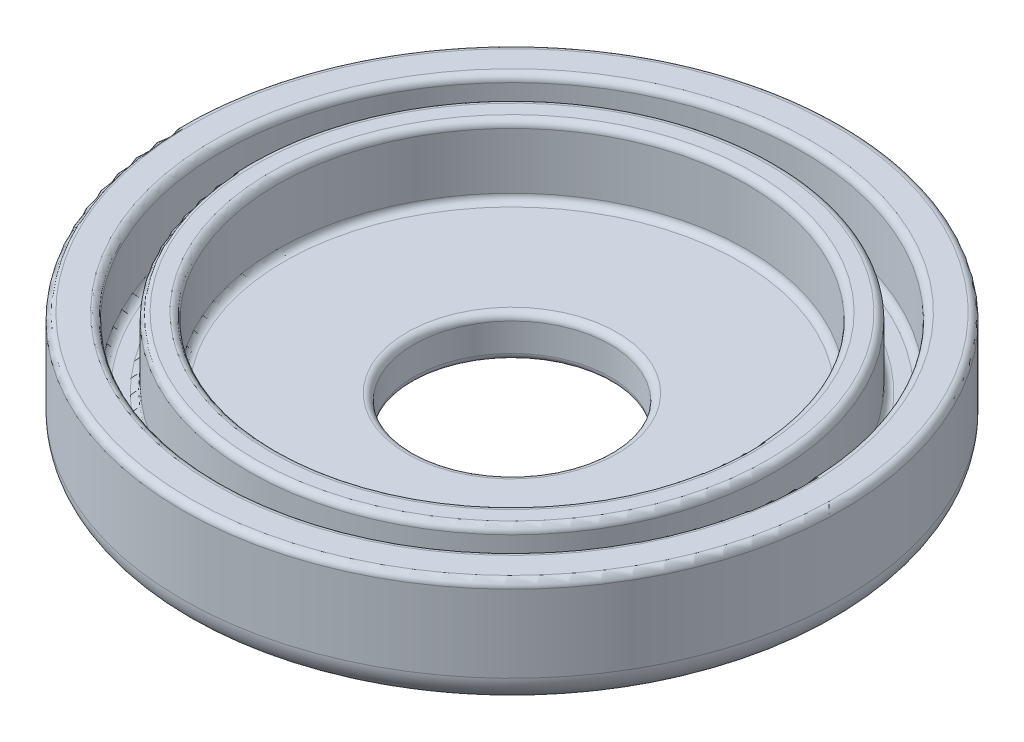
ISO-10303-21;
HEADER;
FILE_DESCRIPTION(('STEP AP214'),'2;1');
FILE_NAME('part.step','',(''),(''),'','','');
FILE_SCHEMA(('AUTOMOTIVE_DESIGN { 1 0 10303 214 1 1 1 1 }'));
ENDSEC;
DATA;
#1=APPLICATION_CONTEXT('core data for automotive mechanical design processes');
#2=APPLICATION_PROTOCOL_DEFINITION('international standard','automotive_design',2000,#1);
#3=PRODUCT_CONTEXT('',#1,'mechanical');
#4=PRODUCT('Part','Part','',(#3));
#5=PRODUCT_RELATED_PRODUCT_CATEGORY('part','',(#4));
#6=PRODUCT_DEFINITION_FORMATION('','',#4);
#7=PRODUCT_DEFINITION_CONTEXT('part definition',#1,'design');
#8=PRODUCT_DEFINITION('design','',#6,#7);
#9=PRODUCT_DEFINITION_SHAPE('','',#8);
#10=(LENGTH_UNIT() NAMED_UNIT(*) SI_UNIT(.MILLI.,.METRE.));
#11=(NAMED_UNIT(*) PLANE_ANGLE_UNIT() SI_UNIT($,.RADIAN.));
#12=(NAMED_UNIT(*) SI_UNIT($,.STERADIAN.) SOLID_ANGLE_UNIT());
#13=UNCERTAINTY_MEASURE_WITH_UNIT(LENGTH_MEASURE(1.E-05),#10,'distance_accuracy_value','');
#14=(GEOMETRIC_REPRESENTATION_CONTEXT(3) GLOBAL_UNCERTAINTY_ASSIGNED_CONTEXT((#13)) GLOBAL_UNIT_ASSIGNED_CONTEXT((#10,
#11,#12)) REPRESENTATION_CONTEXT('',''));
#15=CARTESIAN_POINT('',(0.,0.,0.));
#16=DIRECTION('',(0.,0.,1.));
#17=DIRECTION('',(1.,0.,0.));
#18=AXIS2_PLACEMENT_3D('',#15,#16,#17);
#19=CARTESIAN_POINT('',(0.,8.,0.));
#20=DIRECTION('',(0.,-1.,0.));
#21=DIRECTION('',(0.,0.,-1.));
#22=AXIS2_PLACEMENT_3D('',#19,#20,#21);
#23=CYLINDRICAL_SURFACE('',#22,23.5);
#24=CARTESIAN_POINT('',(0.,2.,0.));
#25=DIRECTION('',(0.,1.,0.));
#26=DIRECTION('',(0.,0.,1.));
#27=AXIS2_PLACEMENT_3D('',#24,#25,#26);
#28=CIRCLE('',#27,23.5);
#29=CARTESIAN_POINT('',(0.,2.,23.5));
#30=VERTEX_POINT('',#29);
#31=EDGE_CURVE('E39',#30,#30,#28,.T.);
#32=ORIENTED_EDGE('',*,*,#31,.T.);
#33=EDGE_LOOP('',(#32));
#34=FACE_BOUND('',#33,.T.);
#35=CARTESIAN_POINT('',(0.,7.5,0.));
#36=DIRECTION('',(0.,1.,0.));
#37=DIRECTION('',(0.,0.,1.));
#38=AXIS2_PLACEMENT_3D('',#35,#36,#37);
#39=CIRCLE('',#38,23.5);
#40=CARTESIAN_POINT('',(0.,7.5,23.5));
#41=VERTEX_POINT('',#40);
#42=EDGE_CURVE('E91',#41,#41,#39,.F.);
#43=ORIENTED_EDGE('',*,*,#42,.T.);
#44=EDGE_LOOP('',(#43));
#45=FACE_BOUND('',#44,.T.);
#46=ADVANCED_FACE('F32',(#34,#45),#23,.T.);
#47=CARTESIAN_POINT('',(0.,8.,0.));
#48=DIRECTION('',(0.,1.,0.));
#49=DIRECTION('',(0.,0.,1.));
#50=AXIS2_PLACEMENT_3D('',#47,#48,#49);
#51=PLANE('',#50);
#52=CARTESIAN_POINT('',(0.,8.,0.));
#53=DIRECTION('',(0.,1.,0.));
#54=DIRECTION('',(0.,0.,1.));
#55=AXIS2_PLACEMENT_3D('',#52,#53,#54);
#56=CIRCLE('',#55,23.);
#57=CARTESIAN_POINT('',(0.,8.,23.));
#58=VERTEX_POINT('',#57);
#59=EDGE_CURVE('E94',#58,#58,#56,.T.);
#60=ORIENTED_EDGE('',*,*,#59,.T.);
#61=EDGE_LOOP('',(#60));
#62=FACE_BOUND('',#61,.T.);
#63=CARTESIAN_POINT('',(0.,8.,0.));
#64=DIRECTION('',(0.,1.,0.));
#65=DIRECTION('',(0.,0.,1.));
#66=AXIS2_PLACEMENT_3D('',#63,#64,#65);
#67=CIRCLE('',#66,21.25);
#68=CARTESIAN_POINT('',(0.,8.,21.25));
#69=VERTEX_POINT('',#68);
#70=EDGE_CURVE('E97',#69,#69,#67,.F.);
#71=ORIENTED_EDGE('',*,*,#70,.T.);
#72=EDGE_LOOP('',(#71));
#73=FACE_BOUND('',#72,.T.);
#74=ADVANCED_FACE('F101',(#62,#73),#51,.T.);
#75=CARTESIAN_POINT('',(0.,0.,0.));
#76=DIRECTION('',(0.,1.,0.));
#77=DIRECTION('',(0.,0.,1.));
#78=AXIS2_PLACEMENT_3D('',#75,#76,#77);
#79=PLANE('',#78);
#80=CARTESIAN_POINT('',(0.,0.,0.));
#81=DIRECTION('',(0.,1.,0.));
#82=DIRECTION('',(0.,0.,1.));
#83=AXIS2_PLACEMENT_3D('',#80,#81,#82);
#84=CIRCLE('',#83,21.5);
#85=CARTESIAN_POINT('',(0.,0.,21.5));
#86=VERTEX_POINT('',#85);
#87=EDGE_CURVE('E10',#86,#86,#84,.F.);
#88=ORIENTED_EDGE('',*,*,#87,.T.);
#89=EDGE_LOOP('',(#88));
#90=FACE_BOUND('',#89,.T.);
#91=CARTESIAN_POINT('',(0.,0.,0.));
#92=DIRECTION('',(0.,1.,0.));
#93=DIRECTION('',(0.,0.,1.));
#94=AXIS2_PLACEMENT_3D('',#91,#92,#93);
#95=CIRCLE('',#94,7.5);
#96=CARTESIAN_POINT('',(0.,0.,7.5));
#97=VERTEX_POINT('',#96);
#98=EDGE_CURVE('E43',#97,#97,#95,.T.);
#99=ORIENTED_EDGE('',*,*,#98,.T.);
#100=EDGE_LOOP('',(#99));
#101=FACE_BOUND('',#100,.T.);
#102=ADVANCED_FACE('F115',(#90,#101),#79,.F.);
#103=CARTESIAN_POINT('',(0.,3.,0.));
#104=DIRECTION('',(0.,1.,0.));
#105=DIRECTION('',(0.,0.,1.));
#106=AXIS2_PLACEMENT_3D('',#103,#104,#105);
#107=CYLINDRICAL_SURFACE('',#106,20.75);
#108=CARTESIAN_POINT('',(0.,7.5,0.));
#109=DIRECTION('',(0.,1.,0.));
#110=DIRECTION('',(0.,0.,1.));
#111=AXIS2_PLACEMENT_3D('',#108,#109,#110);
#112=CIRCLE('',#111,20.75);
#113=CARTESIAN_POINT('',(0.,7.5,20.75));
#114=VERTEX_POINT('',#113);
#115=EDGE_CURVE('E85',#114,#114,#112,.T.);
#116=ORIENTED_EDGE('',*,*,#115,.T.);
#117=EDGE_LOOP('',(#116));
#118=FACE_BOUND('',#117,.T.);
#119=CARTESIAN_POINT('',(0.,3.5,0.));
#120=DIRECTION('',(0.,1.,0.));
#121=DIRECTION('',(0.,0.,1.));
#122=AXIS2_PLACEMENT_3D('',#119,#120,#121);
#123=CIRCLE('',#122,20.75);
#124=CARTESIAN_POINT('',(0.,3.5,20.75));
#125=VERTEX_POINT('',#124);
#126=EDGE_CURVE('E88',#125,#125,#123,.F.);
#127=ORIENTED_EDGE('',*,*,#126,.T.);
#128=EDGE_LOOP('',(#127));
#129=FACE_BOUND('',#128,.T.);
#130=ADVANCED_FACE('F111',(#118,#129),#107,.F.);
#131=CARTESIAN_POINT('',(0.,3.,0.));
#132=DIRECTION('',(0.,1.,0.));
#133=DIRECTION('',(0.,0.,1.));
#134=AXIS2_PLACEMENT_3D('',#131,#132,#133);
#135=PLANE('',#134);
#136=CARTESIAN_POINT('',(0.,3.,0.));
#137=DIRECTION('',(0.,1.,0.));
#138=DIRECTION('',(0.,0.,1.));
#139=AXIS2_PLACEMENT_3D('',#136,#137,#138);
#140=CIRCLE('',#139,20.25);
#141=CARTESIAN_POINT('',(0.,3.,20.25));
#142=VERTEX_POINT('',#141);
#143=EDGE_CURVE('E79',#142,#142,#140,.T.);
#144=ORIENTED_EDGE('',*,*,#143,.T.);
#145=EDGE_LOOP('',(#144));
#146=FACE_BOUND('',#145,.T.);
#147=CARTESIAN_POINT('',(0.,3.,0.));
#148=DIRECTION('',(0.,1.,0.));
#149=DIRECTION('',(0.,0.,1.));
#150=AXIS2_PLACEMENT_3D('',#147,#148,#149);
#151=CIRCLE('',#150,19.25);
#152=CARTESIAN_POINT('',(0.,3.,19.25));
#153=VERTEX_POINT('',#152);
#154=EDGE_CURVE('E82',#153,#153,#151,.F.);
#155=ORIENTED_EDGE('',*,*,#154,.T.);
#156=EDGE_LOOP('',(#155));
#157=FACE_BOUND('',#156,.T.);
#158=ADVANCED_FACE('F114',(#146,#157),#135,.T.);
#159=CARTESIAN_POINT('',(0.,8.,0.));
#160=DIRECTION('',(0.,-1.,0.));
#161=DIRECTION('',(0.,0.,-1.));
#162=AXIS2_PLACEMENT_3D('',#159,#160,#161);
#163=CYLINDRICAL_SURFACE('',#162,18.75);
#164=CARTESIAN_POINT('',(0.,3.5,0.));
#165=DIRECTION('',(0.,1.,0.));
#166=DIRECTION('',(0.,0.,1.));
#167=AXIS2_PLACEMENT_3D('',#164,#165,#166);
#168=CIRCLE('',#167,18.75);
#169=CARTESIAN_POINT('',(0.,3.5,18.75));
#170=VERTEX_POINT('',#169);
#171=EDGE_CURVE('E73',#170,#170,#168,.T.);
#172=ORIENTED_EDGE('',*,*,#171,.T.);
#173=EDGE_LOOP('',(#172));
#174=FACE_BOUND('',#173,.T.);
#175=CARTESIAN_POINT('',(0.,7.5,0.));
#176=DIRECTION('',(0.,1.,0.));
#177=DIRECTION('',(0.,0.,1.));
#178=AXIS2_PLACEMENT_3D('',#175,#176,#177);
#179=CIRCLE('',#178,18.75);
#180=CARTESIAN_POINT('',(0.,7.5,18.75));
#181=VERTEX_POINT('',#180);
#182=EDGE_CURVE('E76',#181,#181,#179,.F.);
#183=ORIENTED_EDGE('',*,*,#182,.T.);
#184=EDGE_LOOP('',(#183));
#185=FACE_BOUND('',#184,.T.);
#186=ADVANCED_FACE('F127',(#174,#185),#163,.T.);
#187=CARTESIAN_POINT('',(0.,8.,0.));
#188=DIRECTION('',(0.,1.,0.));
#189=DIRECTION('',(0.,0.,1.));
#190=AXIS2_PLACEMENT_3D('',#187,#188,#189);
#191=PLANE('',#190);
#192=CARTESIAN_POINT('',(0.,8.,0.));
#193=DIRECTION('',(0.,1.,0.));
#194=DIRECTION('',(0.,0.,1.));
#195=AXIS2_PLACEMENT_3D('',#192,#193,#194);
#196=CIRCLE('',#195,18.25);
#197=CARTESIAN_POINT('',(0.,8.,18.25));
#198=VERTEX_POINT('',#197);
#199=EDGE_CURVE('E67',#198,#198,#196,.T.);
#200=ORIENTED_EDGE('',*,*,#199,.T.);
#201=EDGE_LOOP('',(#200));
#202=FACE_BOUND('',#201,.T.);
#203=CARTESIAN_POINT('',(0.,8.,0.));
#204=DIRECTION('',(0.,1.,0.));
#205=DIRECTION('',(0.,0.,1.));
#206=AXIS2_PLACEMENT_3D('',#203,#204,#205);
#207=CIRCLE('',#206,17.25);
#208=CARTESIAN_POINT('',(0.,8.,17.25));
#209=VERTEX_POINT('',#208);
#210=EDGE_CURVE('E70',#209,#209,#207,.F.);
#211=ORIENTED_EDGE('',*,*,#210,.T.);
#212=EDGE_LOOP('',(#211));
#213=FACE_BOUND('',#212,.T.);
#214=ADVANCED_FACE('F139',(#202,#213),#191,.T.);
#215=CARTESIAN_POINT('',(0.,3.,0.));
#216=DIRECTION('',(0.,1.,0.));
#217=DIRECTION('',(0.,0.,1.));
#218=AXIS2_PLACEMENT_3D('',#215,#216,#217);
#219=CYLINDRICAL_SURFACE('',#218,16.75);
#220=CARTESIAN_POINT('',(0.,7.5,0.));
#221=DIRECTION('',(0.,1.,0.));
#222=DIRECTION('',(0.,0.,1.));
#223=AXIS2_PLACEMENT_3D('',#220,#221,#222);
#224=CIRCLE('',#223,16.75);
#225=CARTESIAN_POINT('',(0.,7.5,16.75));
#226=VERTEX_POINT('',#225);
#227=EDGE_CURVE('E61',#226,#226,#224,.T.);
#228=ORIENTED_EDGE('',*,*,#227,.T.);
#229=EDGE_LOOP('',(#228));
#230=FACE_BOUND('',#229,.T.);
#231=CARTESIAN_POINT('',(0.,3.5,0.));
#232=DIRECTION('',(0.,1.,0.));
#233=DIRECTION('',(0.,0.,1.));
#234=AXIS2_PLACEMENT_3D('',#231,#232,#233);
#235=CIRCLE('',#234,16.75);
#236=CARTESIAN_POINT('',(0.,3.5,16.75));
#237=VERTEX_POINT('',#236);
#238=EDGE_CURVE('E64',#237,#237,#235,.F.);
#239=ORIENTED_EDGE('',*,*,#238,.T.);
#240=EDGE_LOOP('',(#239));
#241=FACE_BOUND('',#240,.T.);
#242=ADVANCED_FACE('F151',(#230,#241),#219,.F.);
#243=CARTESIAN_POINT('',(0.,3.,0.));
#244=DIRECTION('',(0.,1.,0.));
#245=DIRECTION('',(0.,0.,1.));
#246=AXIS2_PLACEMENT_3D('',#243,#244,#245);
#247=PLANE('',#246);
#248=CARTESIAN_POINT('',(0.,3.,0.));
#249=DIRECTION('',(0.,1.,0.));
#250=DIRECTION('',(0.,0.,1.));
#251=AXIS2_PLACEMENT_3D('',#248,#249,#250);
#252=CIRCLE('',#251,16.25);
#253=CARTESIAN_POINT('',(0.,3.,16.25));
#254=VERTEX_POINT('',#253);
#255=EDGE_CURVE('E55',#254,#254,#252,.T.);
#256=ORIENTED_EDGE('',*,*,#255,.T.);
#257=EDGE_LOOP('',(#256));
#258=FACE_BOUND('',#257,.T.);
#259=CARTESIAN_POINT('',(0.,3.,0.));
#260=DIRECTION('',(0.,1.,0.));
#261=DIRECTION('',(0.,0.,1.));
#262=AXIS2_PLACEMENT_3D('',#259,#260,#261);
#263=CIRCLE('',#262,7.5);
#264=CARTESIAN_POINT('',(0.,3.,7.5));
#265=VERTEX_POINT('',#264);
#266=EDGE_CURVE('E58',#265,#265,#263,.F.);
#267=ORIENTED_EDGE('',*,*,#266,.T.);
#268=EDGE_LOOP('',(#267));
#269=FACE_BOUND('',#268,.T.);
#270=ADVANCED_FACE('F163',(#258,#269),#247,.T.);
#271=CARTESIAN_POINT('',(0.,-2.,0.));
#272=DIRECTION('',(0.,1.,0.));
#273=DIRECTION('',(0.,0.,1.));
#274=AXIS2_PLACEMENT_3D('',#271,#272,#273);
#275=CYLINDRICAL_SURFACE('',#274,7.);
#276=CARTESIAN_POINT('',(0.,2.5,0.));
#277=DIRECTION('',(0.,1.,0.));
#278=DIRECTION('',(0.,0.,1.));
#279=AXIS2_PLACEMENT_3D('',#276,#277,#278);
#280=CIRCLE('',#279,7.);
#281=CARTESIAN_POINT('',(0.,2.5,7.));
#282=VERTEX_POINT('',#281);
#283=EDGE_CURVE('E47',#282,#282,#280,.T.);
#284=ORIENTED_EDGE('',*,*,#283,.T.);
#285=EDGE_LOOP('',(#284));
#286=FACE_BOUND('',#285,.T.);
#287=CARTESIAN_POINT('',(0.,0.5,0.));
#288=DIRECTION('',(0.,1.,0.));
#289=DIRECTION('',(0.,0.,1.));
#290=AXIS2_PLACEMENT_3D('',#287,#288,#289);
#291=CIRCLE('',#290,7.);
#292=CARTESIAN_POINT('',(0.,0.5,7.));
#293=VERTEX_POINT('',#292);
#294=EDGE_CURVE('E52',#293,#293,#291,.F.);
#295=ORIENTED_EDGE('',*,*,#294,.T.);
#296=EDGE_LOOP('',(#295));
#297=FACE_BOUND('',#296,.T.);
#298=ADVANCED_FACE('F175',(#286,#297),#275,.F.);
#299=CARTESIAN_POINT('',(0.,7.5,0.));
#300=DIRECTION('',(0.,1.,0.));
#301=DIRECTION('',(0.,0.,1.));
#302=AXIS2_PLACEMENT_3D('',#299,#300,#301);
#303=TOROIDAL_SURFACE('',#302,23.,0.5);
#304=ORIENTED_EDGE('',*,*,#42,.F.);
#305=EDGE_LOOP('',(#304));
#306=FACE_BOUND('',#305,.T.);
#307=ORIENTED_EDGE('',*,*,#59,.F.);
#308=EDGE_LOOP('',(#307));
#309=FACE_BOUND('',#308,.T.);
#310=ADVANCED_FACE('F107',(#306,#309),#303,.T.);
#311=CARTESIAN_POINT('',(0.,7.5,0.));
#312=DIRECTION('',(0.,1.,0.));
#313=DIRECTION('',(0.,0.,1.));
#314=AXIS2_PLACEMENT_3D('',#311,#312,#313);
#315=TOROIDAL_SURFACE('',#314,21.25,0.5);
#316=ORIENTED_EDGE('',*,*,#70,.F.);
#317=EDGE_LOOP('',(#316));
#318=FACE_BOUND('',#317,.T.);
#319=ORIENTED_EDGE('',*,*,#115,.F.);
#320=EDGE_LOOP('',(#319));
#321=FACE_BOUND('',#320,.T.);
#322=ADVANCED_FACE('F103',(#318,#321),#315,.T.);
#323=CARTESIAN_POINT('',(0.,3.5,0.));
#324=DIRECTION('',(0.,1.,0.));
#325=DIRECTION('',(0.,0.,1.));
#326=AXIS2_PLACEMENT_3D('',#323,#324,#325);
#327=TOROIDAL_SURFACE('',#326,20.25,0.5);
#328=ORIENTED_EDGE('',*,*,#126,.F.);
#329=EDGE_LOOP('',(#328));
#330=FACE_BOUND('',#329,.T.);
#331=ORIENTED_EDGE('',*,*,#143,.F.);
#332=EDGE_LOOP('',(#331));
#333=FACE_BOUND('',#332,.T.);
#334=ADVANCED_FACE('F106',(#330,#333),#327,.F.);
#335=CARTESIAN_POINT('',(0.,3.5,0.));
#336=DIRECTION('',(0.,1.,0.));
#337=DIRECTION('',(0.,0.,1.));
#338=AXIS2_PLACEMENT_3D('',#335,#336,#337);
#339=TOROIDAL_SURFACE('',#338,19.25,0.5);
#340=ORIENTED_EDGE('',*,*,#154,.F.);
#341=EDGE_LOOP('',(#340));
#342=FACE_BOUND('',#341,.T.);
#343=ORIENTED_EDGE('',*,*,#171,.F.);
#344=EDGE_LOOP('',(#343));
#345=FACE_BOUND('',#344,.T.);
#346=ADVANCED_FACE('F121',(#342,#345),#339,.F.);
#347=CARTESIAN_POINT('',(0.,7.5,0.));
#348=DIRECTION('',(0.,1.,0.));
#349=DIRECTION('',(0.,0.,1.));
#350=AXIS2_PLACEMENT_3D('',#347,#348,#349);
#351=TOROIDAL_SURFACE('',#350,18.25,0.5);
#352=ORIENTED_EDGE('',*,*,#182,.F.);
#353=EDGE_LOOP('',(#352));
#354=FACE_BOUND('',#353,.T.);
#355=ORIENTED_EDGE('',*,*,#199,.F.);
#356=EDGE_LOOP('',(#355));
#357=FACE_BOUND('',#356,.T.);
#358=ADVANCED_FACE('F133',(#354,#357),#351,.T.);
#359=CARTESIAN_POINT('',(0.,7.5,0.));
#360=DIRECTION('',(0.,1.,0.));
#361=DIRECTION('',(0.,0.,1.));
#362=AXIS2_PLACEMENT_3D('',#359,#360,#361);
#363=TOROIDAL_SURFACE('',#362,17.25,0.5);
#364=ORIENTED_EDGE('',*,*,#210,.F.);
#365=EDGE_LOOP('',(#364));
#366=FACE_BOUND('',#365,.T.);
#367=ORIENTED_EDGE('',*,*,#227,.F.);
#368=EDGE_LOOP('',(#367));
#369=FACE_BOUND('',#368,.T.);
#370=ADVANCED_FACE('F145',(#366,#369),#363,.T.);
#371=CARTESIAN_POINT('',(0.,3.5,0.));
#372=DIRECTION('',(0.,1.,0.));
#373=DIRECTION('',(0.,0.,1.));
#374=AXIS2_PLACEMENT_3D('',#371,#372,#373);
#375=TOROIDAL_SURFACE('',#374,16.25,0.5);
#376=ORIENTED_EDGE('',*,*,#238,.F.);
#377=EDGE_LOOP('',(#376));
#378=FACE_BOUND('',#377,.T.);
#379=ORIENTED_EDGE('',*,*,#255,.F.);
#380=EDGE_LOOP('',(#379));
#381=FACE_BOUND('',#380,.T.);
#382=ADVANCED_FACE('F157',(#378,#381),#375,.F.);
#383=CARTESIAN_POINT('',(0.,2.5,0.));
#384=DIRECTION('',(0.,1.,0.));
#385=DIRECTION('',(0.,0.,1.));
#386=AXIS2_PLACEMENT_3D('',#383,#384,#385);
#387=TOROIDAL_SURFACE('',#386,7.5,0.5);
#388=ORIENTED_EDGE('',*,*,#266,.F.);
#389=EDGE_LOOP('',(#388));
#390=FACE_BOUND('',#389,.T.);
#391=ORIENTED_EDGE('',*,*,#283,.F.);
#392=EDGE_LOOP('',(#391));
#393=FACE_BOUND('',#392,.T.);
#394=ADVANCED_FACE('F169',(#390,#393),#387,.T.);
#395=CARTESIAN_POINT('',(0.,0.5,0.));
#396=DIRECTION('',(0.,1.,0.));
#397=DIRECTION('',(0.,0.,1.));
#398=AXIS2_PLACEMENT_3D('',#395,#396,#397);
#399=TOROIDAL_SURFACE('',#398,7.5,0.5);
#400=ORIENTED_EDGE('',*,*,#294,.F.);
#401=EDGE_LOOP('',(#400));
#402=FACE_BOUND('',#401,.T.);
#403=ORIENTED_EDGE('',*,*,#98,.F.);
#404=EDGE_LOOP('',(#403));
#405=FACE_BOUND('',#404,.T.);
#406=ADVANCED_FACE('F181',(#402,#405),#399,.T.);
#407=CARTESIAN_POINT('',(0.,2.,0.));
#408=DIRECTION('',(0.,1.,0.));
#409=DIRECTION('',(0.,0.,1.));
#410=AXIS2_PLACEMENT_3D('',#407,#408,#409);
#411=TOROIDAL_SURFACE('',#410,21.5,2.);
#412=ORIENTED_EDGE('',*,*,#87,.F.);
#413=EDGE_LOOP('',(#412));
#414=FACE_BOUND('',#413,.T.);
#415=ORIENTED_EDGE('',*,*,#31,.F.);
#416=EDGE_LOOP('',(#415));
#417=FACE_BOUND('',#416,.T.);
#418=ADVANCED_FACE('F34',(#414,#417),#411,.T.);
#419=CLOSED_SHELL('',(#46,#74,#102,#130,#158,#186,#214,#242,#270,#298,#310,#322,#334,#346,#358,
#370,#382,#394,#406,#418));
#420=MANIFOLD_SOLID_BREP('B2',#419);
#421=ADVANCED_BREP_SHAPE_REPRESENTATION('',(#18,#420),#14);
#422=SHAPE_DEFINITION_REPRESENTATION(#9,#421);
ENDSEC;
END-ISO-10303-21;
